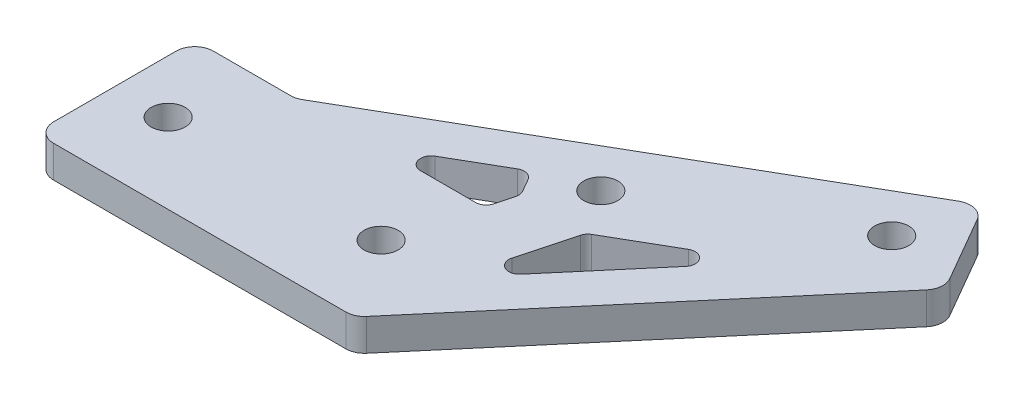
ISO-10303-21;
HEADER;
FILE_DESCRIPTION(('STEP AP214'),'2;1');
FILE_NAME('part.step','',(''),(''),'','','');
FILE_SCHEMA(('AUTOMOTIVE_DESIGN { 1 0 10303 214 1 1 1 1 }'));
ENDSEC;
DATA;
#1=APPLICATION_CONTEXT('core data for automotive mechanical design processes');
#2=APPLICATION_PROTOCOL_DEFINITION('international standard','automotive_design',2000,#1);
#3=PRODUCT_CONTEXT('',#1,'mechanical');
#4=PRODUCT('Part','Part','',(#3));
#5=PRODUCT_RELATED_PRODUCT_CATEGORY('part','',(#4));
#6=PRODUCT_DEFINITION_FORMATION('','',#4);
#7=PRODUCT_DEFINITION_CONTEXT('part definition',#1,'design');
#8=PRODUCT_DEFINITION('design','',#6,#7);
#9=PRODUCT_DEFINITION_SHAPE('','',#8);
#10=(LENGTH_UNIT() NAMED_UNIT(*) SI_UNIT(.MILLI.,.METRE.));
#11=(NAMED_UNIT(*) PLANE_ANGLE_UNIT() SI_UNIT($,.RADIAN.));
#12=(NAMED_UNIT(*) SI_UNIT($,.STERADIAN.) SOLID_ANGLE_UNIT());
#13=UNCERTAINTY_MEASURE_WITH_UNIT(LENGTH_MEASURE(1.E-05),#10,'distance_accuracy_value','');
#14=(GEOMETRIC_REPRESENTATION_CONTEXT(3) GLOBAL_UNCERTAINTY_ASSIGNED_CONTEXT((#13)) GLOBAL_UNIT_ASSIGNED_CONTEXT((#10,
#11,#12)) REPRESENTATION_CONTEXT('',''));
#15=CARTESIAN_POINT('',(0.,0.,0.));
#16=DIRECTION('',(0.,0.,1.));
#17=DIRECTION('',(1.,0.,0.));
#18=AXIS2_PLACEMENT_3D('',#15,#16,#17);
#19=CARTESIAN_POINT('',(0.,1.5,0.));
#20=DIRECTION('',(0.,-1.,0.));
#21=DIRECTION('',(0.,0.,-1.));
#22=AXIS2_PLACEMENT_3D('',#19,#20,#21);
#23=PLANE('',#22);
#24=DIRECTION('',(-0.258819045102521,0.,0.965925826289068));
#25=VECTOR('',#24,1.);
#26=CARTESIAN_POINT('',(31.1181061733477,1.5,8.33807141913447));
#27=LINE('',#26,#25);
#28=CARTESIAN_POINT('',(33.9555869090365,1.5,-2.2515508519542));
#29=VERTEX_POINT('',#28);
#30=CARTESIAN_POINT('',(32.5994607267854,1.5,2.80958096168154));
#31=VERTEX_POINT('',#30);
#32=EDGE_CURVE('E257',#29,#31,#27,.T.);
#33=ORIENTED_EDGE('',*,*,#32,.F.);
#34=CARTESIAN_POINT('',(34.9215127353256,1.5,-1.99273180685168));
#35=DIRECTION('',(0.,-1.,0.));
#36=DIRECTION('',(0.,0.,-1.));
#37=AXIS2_PLACEMENT_3D('',#34,#35,#36);
#38=CIRCLE('',#37,1.);
#39=CARTESIAN_POINT('',(34.4215127353256,1.5,-2.85875721063612));
#40=VERTEX_POINT('',#39);
#41=EDGE_CURVE('E359',#29,#40,#38,.T.);
#42=ORIENTED_EDGE('',*,*,#41,.T.);
#43=DIRECTION('',(0.866025403784438,0.,-0.500000000000001));
#44=VECTOR('',#43,1.);
#45=CARTESIAN_POINT('',(7.36750000000004,1.5,12.7608843247637));
#46=LINE('',#45,#44);
#47=CARTESIAN_POINT('',(40.1791176898745,1.5,-6.18291198103244));
#48=VERTEX_POINT('',#47);
#49=EDGE_CURVE('E254',#40,#48,#46,.T.);
#50=ORIENTED_EDGE('',*,*,#49,.T.);
#51=CARTESIAN_POINT('',(40.6791176898745,1.5,-5.31688657724799));
#52=DIRECTION('',(0.,-1.,0.));
#53=DIRECTION('',(0.,0.,-1.));
#54=AXIS2_PLACEMENT_3D('',#51,#52,#53);
#55=CIRCLE('',#54,1.);
#56=CARTESIAN_POINT('',(41.4416742649251,1.5,-4.66996504425723));
#57=VERTEX_POINT('',#56);
#58=EDGE_CURVE('E363',#48,#57,#55,.T.);
#59=ORIENTED_EDGE('',*,*,#58,.T.);
#60=DIRECTION('',(0.646921532990766,0.,-0.762556575050584));
#61=VECTOR('',#60,1.);
#62=CARTESIAN_POINT('',(21.7942636322427,1.5,18.4893539714611));
#63=LINE('',#62,#61);
#64=CARTESIAN_POINT('',(34.327943128125,1.5,3.71532153977483));
#65=VERTEX_POINT('',#64);
#66=EDGE_CURVE('E247',#65,#57,#63,.T.);
#67=ORIENTED_EDGE('',*,*,#66,.F.);
#68=CARTESIAN_POINT('',(33.5653865530744,1.5,3.06840000678406));
#69=DIRECTION('',(0.,-1.,0.));
#70=DIRECTION('',(0.,0.,-1.));
#71=AXIS2_PLACEMENT_3D('',#68,#69,#70);
#72=CIRCLE('',#71,1.);
#73=EDGE_CURVE('E355',#65,#31,#72,.T.);
#74=ORIENTED_EDGE('',*,*,#73,.T.);
#75=EDGE_LOOP('',(#33,#42,#50,#59,#67,#74));
#76=FACE_BOUND('',#75,.T.);
#77=DIRECTION('',(-1.,0.,0.));
#78=VECTOR('',#77,1.);
#79=CARTESIAN_POINT('',(0.,1.5,0.));
#80=LINE('',#79,#78);
#81=CARTESIAN_POINT('',(9.00108891324583,1.5,0.));
#82=VERTEX_POINT('',#81);
#83=CARTESIAN_POINT('',(1.75,1.5,0.));
#84=VERTEX_POINT('',#83);
#85=EDGE_CURVE('E290',#82,#84,#80,.T.);
#86=ORIENTED_EDGE('',*,*,#85,.T.);
#87=CARTESIAN_POINT('',(1.75,1.5,1.75));
#88=DIRECTION('',(0.,-1.,0.));
#89=DIRECTION('',(0.,0.,-1.));
#90=AXIS2_PLACEMENT_3D('',#87,#88,#89);
#91=CIRCLE('',#90,1.75);
#92=CARTESIAN_POINT('',(0.,1.5,1.75));
#93=VERTEX_POINT('',#92);
#94=EDGE_CURVE('E403',#84,#93,#91,.F.);
#95=ORIENTED_EDGE('',*,*,#94,.T.);
#96=DIRECTION('',(0.,0.,1.));
#97=VECTOR('',#96,1.);
#98=CARTESIAN_POINT('',(0.,1.5,15.));
#99=LINE('',#98,#97);
#100=CARTESIAN_POINT('',(0.,1.5,13.25));
#101=VERTEX_POINT('',#100);
#102=EDGE_CURVE('E294',#93,#101,#99,.T.);
#103=ORIENTED_EDGE('',*,*,#102,.T.);
#104=CARTESIAN_POINT('',(1.75,1.5,13.25));
#105=DIRECTION('',(0.,-1.,0.));
#106=DIRECTION('',(0.,0.,-1.));
#107=AXIS2_PLACEMENT_3D('',#104,#105,#106);
#108=CIRCLE('',#107,1.75);
#109=CARTESIAN_POINT('',(1.75000000000001,1.5,15.));
#110=VERTEX_POINT('',#109);
#111=EDGE_CURVE('E401',#101,#110,#108,.F.);
#112=ORIENTED_EDGE('',*,*,#111,.T.);
#113=DIRECTION('',(1.,0.,0.));
#114=VECTOR('',#113,1.);
#115=CARTESIAN_POINT('',(30.,1.5,15.));
#116=LINE('',#115,#114);
#117=CARTESIAN_POINT('',(29.1897160978185,1.5,15.));
#118=VERTEX_POINT('',#117);
#119=EDGE_CURVE('E297',#110,#118,#116,.T.);
#120=ORIENTED_EDGE('',*,*,#119,.T.);
#121=CARTESIAN_POINT('',(29.1897160978185,1.5,13.25));
#122=DIRECTION('',(0.,-1.,0.));
#123=DIRECTION('',(0.,0.,-1.));
#124=AXIS2_PLACEMENT_3D('',#121,#122,#123);
#125=CIRCLE('',#124,1.75);
#126=CARTESIAN_POINT('',(30.524190104157,1.5,14.3821126827338));
#127=VERTEX_POINT('',#126);
#128=EDGE_CURVE('E396',#118,#127,#125,.F.);
#129=ORIENTED_EDGE('',*,*,#128,.T.);
#130=DIRECTION('',(0.646921532990766,0.,-0.762556575050584));
#131=VECTOR('',#130,1.);
#132=CARTESIAN_POINT('',(55.4507621135331,1.5,-15.));
#133=LINE('',#132,#131);
#134=CARTESIAN_POINT('',(54.6534768491289,1.5,-14.0602026836986));
#135=VERTEX_POINT('',#134);
#136=EDGE_CURVE('E300',#127,#135,#133,.T.);
#137=ORIENTED_EDGE('',*,*,#136,.T.);
#138=CARTESIAN_POINT('',(53.3190028427904,1.5,-15.1923153664324));
#139=DIRECTION('',(0.,-1.,0.));
#140=DIRECTION('',(0.,0.,-1.));
#141=AXIS2_PLACEMENT_3D('',#138,#139,#140);
#142=CIRCLE('',#141,1.75);
#143=CARTESIAN_POINT('',(54.8345472994132,1.5,-16.0673153664324));
#144=VERTEX_POINT('',#143);
#145=EDGE_CURVE('E54',#135,#144,#142,.F.);
#146=ORIENTED_EDGE('',*,*,#145,.T.);
#147=DIRECTION('',(-0.500000000000002,0.,-0.866025403784437));
#148=VECTOR('',#147,1.);
#149=CARTESIAN_POINT('',(50.4507621135332,1.5,-23.6602540378443));
#150=LINE('',#149,#148);
#151=CARTESIAN_POINT('',(51.3257621135332,1.5,-22.1447095812216));
#152=VERTEX_POINT('',#151);
#153=EDGE_CURVE('E302',#144,#152,#150,.T.);
#154=ORIENTED_EDGE('',*,*,#153,.T.);
#155=CARTESIAN_POINT('',(49.8102176569104,1.5,-21.2697095812216));
#156=DIRECTION('',(0.,-1.,0.));
#157=DIRECTION('',(0.,0.,-1.));
#158=AXIS2_PLACEMENT_3D('',#155,#156,#157);
#159=CIRCLE('',#158,1.75);
#160=CARTESIAN_POINT('',(48.9352176569104,1.5,-22.7852540378443));
#161=VERTEX_POINT('',#160);
#162=EDGE_CURVE('E399',#152,#161,#159,.F.);
#163=ORIENTED_EDGE('',*,*,#162,.T.);
#164=DIRECTION('',(-0.866025403784437,0.,0.500000000000002));
#165=VECTOR('',#164,1.);
#166=CARTESIAN_POINT('',(24.47,1.5,-8.66025403784428));
#167=LINE('',#166,#165);
#168=CARTESIAN_POINT('',(9.87608891324584,1.5,-0.234455543377227));
#169=VERTEX_POINT('',#168);
#170=EDGE_CURVE('E287',#161,#169,#167,.T.);
#171=ORIENTED_EDGE('',*,*,#170,.T.);
#172=CARTESIAN_POINT('',(9.00108891324583,1.5,-1.75));
#173=DIRECTION('',(0.,-1.,0.));
#174=DIRECTION('',(0.,0.,-1.));
#175=AXIS2_PLACEMENT_3D('',#172,#173,#174);
#176=CIRCLE('',#175,1.75);
#177=EDGE_CURVE('E11',#169,#82,#176,.T.);
#178=ORIENTED_EDGE('',*,*,#177,.T.);
#179=EDGE_LOOP('',(#86,#95,#103,#112,#120,#129,#137,#146,#154,#163,#171,#178));
#180=FACE_BOUND('',#179,.T.);
#181=CARTESIAN_POINT('',(48.620635094611,1.5,-16.8301270189222));
#182=DIRECTION('',(0.,1.,0.));
#183=DIRECTION('',(0.,0.,1.));
#184=AXIS2_PLACEMENT_3D('',#181,#182,#183);
#185=CIRCLE('',#184,1.59999999999999);
#186=CARTESIAN_POINT('',(48.620635094611,1.5,-15.2301270189222));
#187=VERTEX_POINT('',#186);
#188=EDGE_CURVE('E281',#187,#187,#185,.T.);
#189=ORIENTED_EDGE('',*,*,#188,.F.);
#190=EDGE_LOOP('',(#189));
#191=FACE_BOUND('',#190,.T.);
#192=CARTESIAN_POINT('',(25.,1.5,7.5));
#193=DIRECTION('',(0.,1.,0.));
#194=DIRECTION('',(0.,0.,1.));
#195=AXIS2_PLACEMENT_3D('',#192,#193,#194);
#196=CIRCLE('',#195,1.6);
#197=CARTESIAN_POINT('',(25.,1.5,9.1));
#198=VERTEX_POINT('',#197);
#199=EDGE_CURVE('E275',#198,#198,#196,.T.);
#200=ORIENTED_EDGE('',*,*,#199,.F.);
#201=EDGE_LOOP('',(#200));
#202=FACE_BOUND('',#201,.T.);
#203=CARTESIAN_POINT('',(31.3001270189222,1.5,-6.83012701892215));
#204=DIRECTION('',(0.,1.,0.));
#205=DIRECTION('',(0.,0.,1.));
#206=AXIS2_PLACEMENT_3D('',#203,#204,#205);
#207=CIRCLE('',#206,1.60000000000001);
#208=CARTESIAN_POINT('',(31.3001270189222,1.5,-5.23012701892213));
#209=VERTEX_POINT('',#208);
#210=EDGE_CURVE('E269',#209,#209,#207,.T.);
#211=ORIENTED_EDGE('',*,*,#210,.F.);
#212=EDGE_LOOP('',(#211));
#213=FACE_BOUND('',#212,.T.);
#214=CARTESIAN_POINT('',(5.,1.5,7.5));
#215=DIRECTION('',(0.,1.,0.));
#216=DIRECTION('',(0.,0.,1.));
#217=AXIS2_PLACEMENT_3D('',#214,#215,#216);
#218=CIRCLE('',#217,1.6);
#219=CARTESIAN_POINT('',(5.,1.5,9.1));
#220=VERTEX_POINT('',#219);
#221=EDGE_CURVE('E262',#220,#220,#218,.T.);
#222=ORIENTED_EDGE('',*,*,#221,.F.);
#223=EDGE_LOOP('',(#222));
#224=FACE_BOUND('',#223,.T.);
#225=DIRECTION('',(0.500000000000001,0.,0.866025403784438));
#226=VECTOR('',#225,1.);
#227=CARTESIAN_POINT('',(22.1025,1.5,-12.7608843247637));
#228=LINE('',#227,#226);
#229=CARTESIAN_POINT('',(26.9700000000001,1.5,-4.33012701892208));
#230=VERTEX_POINT('',#229);
#231=CARTESIAN_POINT('',(27.6719029611437,1.5,-3.11439542823822));
#232=VERTEX_POINT('',#231);
#233=EDGE_CURVE('E239',#230,#232,#228,.T.);
#234=ORIENTED_EDGE('',*,*,#233,.T.);
#235=CARTESIAN_POINT('',(26.8058775573593,1.5,-2.61439542823822));
#236=DIRECTION('',(0.,-1.,0.));
#237=DIRECTION('',(0.,0.,-1.));
#238=AXIS2_PLACEMENT_3D('',#235,#236,#237);
#239=CIRCLE('',#238,1.);
#240=CARTESIAN_POINT('',(27.7718033836483,1.5,-2.3555763831357));
#241=VERTEX_POINT('',#240);
#242=EDGE_CURVE('E348',#232,#241,#239,.T.);
#243=ORIENTED_EDGE('',*,*,#242,.T.);
#244=DIRECTION('',(-0.258819045102522,0.,0.965925826289068));
#245=VECTOR('',#244,1.);
#246=CARTESIAN_POINT('',(25.3225512156133,1.5,6.78515714851935));
#247=LINE('',#246,#245);
#248=CARTESIAN_POINT('',(27.3392274323874,1.5,-0.741180954897477));
#249=VERTEX_POINT('',#248);
#250=EDGE_CURVE('E253',#241,#249,#247,.T.);
#251=ORIENTED_EDGE('',*,*,#250,.T.);
#252=CARTESIAN_POINT('',(26.3733016060983,1.5,-1.));
#253=DIRECTION('',(0.,-1.,0.));
#254=DIRECTION('',(0.,0.,-1.));
#255=AXIS2_PLACEMENT_3D('',#252,#253,#254);
#256=CIRCLE('',#255,1.);
#257=CARTESIAN_POINT('',(26.3733016060983,1.5,0.));
#258=VERTEX_POINT('',#257);
#259=EDGE_CURVE('E232',#249,#258,#256,.T.);
#260=ORIENTED_EDGE('',*,*,#259,.T.);
#261=DIRECTION('',(1.,0.,0.));
#262=VECTOR('',#261,1.);
#263=CARTESIAN_POINT('',(0.,1.5,0.));
#264=LINE('',#263,#262);
#265=CARTESIAN_POINT('',(21.2020508075691,1.5,0.));
#266=VERTEX_POINT('',#265);
#267=EDGE_CURVE('E223',#266,#258,#264,.T.);
#268=ORIENTED_EDGE('',*,*,#267,.F.);
#269=CARTESIAN_POINT('',(21.2020508075691,1.5,-1.));
#270=DIRECTION('',(0.,-1.,0.));
#271=DIRECTION('',(0.,0.,-1.));
#272=AXIS2_PLACEMENT_3D('',#269,#270,#271);
#273=CIRCLE('',#272,1.);
#274=CARTESIAN_POINT('',(20.7020508075691,1.5,-1.86602540378444));
#275=VERTEX_POINT('',#274);
#276=EDGE_CURVE('E206',#266,#275,#273,.T.);
#277=ORIENTED_EDGE('',*,*,#276,.T.);
#278=DIRECTION('',(-0.866025403784438,0.,0.500000000000002));
#279=VECTOR('',#278,1.);
#280=CARTESIAN_POINT('',(4.3675000000001,1.5,7.56473190205721));
#281=LINE('',#280,#279);
#282=CARTESIAN_POINT('',(25.6039745962156,1.5,-4.69615242270653));
#283=VERTEX_POINT('',#282);
#284=EDGE_CURVE('E234',#283,#275,#281,.T.);
#285=ORIENTED_EDGE('',*,*,#284,.F.);
#286=CARTESIAN_POINT('',(26.1039745962156,1.5,-3.83012701892209));
#287=DIRECTION('',(0.,-1.,0.));
#288=DIRECTION('',(0.,0.,-1.));
#289=AXIS2_PLACEMENT_3D('',#286,#287,#288);
#290=CIRCLE('',#289,1.);
#291=EDGE_CURVE('E367',#283,#230,#290,.T.);
#292=ORIENTED_EDGE('',*,*,#291,.T.);
#293=EDGE_LOOP('',(#234,#243,#251,#260,#268,#277,#285,#292));
#294=FACE_BOUND('',#293,.T.);
#295=ADVANCED_FACE('F32',(#76,#180,#191,#202,#213,#224,#294),#23,.F.);
#296=CARTESIAN_POINT('',(0.,-1.5,0.));
#297=DIRECTION('',(0.,-1.,0.));
#298=DIRECTION('',(0.,0.,-1.));
#299=AXIS2_PLACEMENT_3D('',#296,#297,#298);
#300=PLANE('',#299);
#301=CARTESIAN_POINT('',(31.3001270189222,-1.5,-6.83012701892215));
#302=DIRECTION('',(0.,1.,0.));
#303=DIRECTION('',(0.,0.,1.));
#304=AXIS2_PLACEMENT_3D('',#301,#302,#303);
#305=CIRCLE('',#304,1.60000000000001);
#306=CARTESIAN_POINT('',(31.3001270189222,-1.5,-5.23012701892213));
#307=VERTEX_POINT('',#306);
#308=EDGE_CURVE('E265',#307,#307,#305,.T.);
#309=ORIENTED_EDGE('',*,*,#308,.T.);
#310=EDGE_LOOP('',(#309));
#311=FACE_BOUND('',#310,.T.);
#312=CARTESIAN_POINT('',(48.620635094611,-1.5,-16.8301270189222));
#313=DIRECTION('',(0.,1.,0.));
#314=DIRECTION('',(0.,0.,1.));
#315=AXIS2_PLACEMENT_3D('',#312,#313,#314);
#316=CIRCLE('',#315,1.59999999999999);
#317=CARTESIAN_POINT('',(48.620635094611,-1.5,-15.2301270189222));
#318=VERTEX_POINT('',#317);
#319=EDGE_CURVE('E278',#318,#318,#316,.T.);
#320=ORIENTED_EDGE('',*,*,#319,.T.);
#321=EDGE_LOOP('',(#320));
#322=FACE_BOUND('',#321,.T.);
#323=DIRECTION('',(0.,0.,1.));
#324=VECTOR('',#323,1.);
#325=CARTESIAN_POINT('',(0.,-1.5,15.));
#326=LINE('',#325,#324);
#327=CARTESIAN_POINT('',(0.,-1.5,1.75));
#328=VERTEX_POINT('',#327);
#329=CARTESIAN_POINT('',(0.,-1.5,13.25));
#330=VERTEX_POINT('',#329);
#331=EDGE_CURVE('E309',#328,#330,#326,.T.);
#332=ORIENTED_EDGE('',*,*,#331,.F.);
#333=CARTESIAN_POINT('',(1.75,-1.5,1.75));
#334=DIRECTION('',(0.,-1.,0.));
#335=DIRECTION('',(0.,0.,-1.));
#336=AXIS2_PLACEMENT_3D('',#333,#334,#335);
#337=CIRCLE('',#336,1.75);
#338=CARTESIAN_POINT('',(1.75,-1.5,0.));
#339=VERTEX_POINT('',#338);
#340=EDGE_CURVE('E394',#328,#339,#337,.T.);
#341=ORIENTED_EDGE('',*,*,#340,.T.);
#342=DIRECTION('',(-1.,0.,0.));
#343=VECTOR('',#342,1.);
#344=CARTESIAN_POINT('',(0.,-1.5,0.));
#345=LINE('',#344,#343);
#346=CARTESIAN_POINT('',(9.00108891324583,-1.5,0.));
#347=VERTEX_POINT('',#346);
#348=EDGE_CURVE('E306',#347,#339,#345,.T.);
#349=ORIENTED_EDGE('',*,*,#348,.F.);
#350=CARTESIAN_POINT('',(9.00108891324583,-1.5,-1.75));
#351=DIRECTION('',(0.,-1.,0.));
#352=DIRECTION('',(0.,0.,-1.));
#353=AXIS2_PLACEMENT_3D('',#350,#351,#352);
#354=CIRCLE('',#353,1.75);
#355=CARTESIAN_POINT('',(9.87608891324584,-1.5,-0.234455543377237));
#356=VERTEX_POINT('',#355);
#357=EDGE_CURVE('E40',#347,#356,#354,.F.);
#358=ORIENTED_EDGE('',*,*,#357,.T.);
#359=DIRECTION('',(-0.866025403784438,0.,0.500000000000001));
#360=VECTOR('',#359,1.);
#361=CARTESIAN_POINT('',(24.47,-1.5,-8.66025403784428));
#362=LINE('',#361,#360);
#363=CARTESIAN_POINT('',(48.9352176569104,-1.5,-22.7852540378443));
#364=VERTEX_POINT('',#363);
#365=EDGE_CURVE('E284',#364,#356,#362,.T.);
#366=ORIENTED_EDGE('',*,*,#365,.F.);
#367=CARTESIAN_POINT('',(49.8102176569104,-1.5,-21.2697095812216));
#368=DIRECTION('',(0.,-1.,0.));
#369=DIRECTION('',(0.,0.,-1.));
#370=AXIS2_PLACEMENT_3D('',#367,#368,#369);
#371=CIRCLE('',#370,1.75);
#372=CARTESIAN_POINT('',(51.3257621135332,-1.5,-22.1447095812216));
#373=VERTEX_POINT('',#372);
#374=EDGE_CURVE('E390',#364,#373,#371,.T.);
#375=ORIENTED_EDGE('',*,*,#374,.T.);
#376=DIRECTION('',(-0.500000000000002,0.,-0.866025403784437));
#377=VECTOR('',#376,1.);
#378=CARTESIAN_POINT('',(50.4507621135332,-1.5,-23.6602540378443));
#379=LINE('',#378,#377);
#380=CARTESIAN_POINT('',(54.8345472994132,-1.5,-16.0673153664324));
#381=VERTEX_POINT('',#380);
#382=EDGE_CURVE('E291',#381,#373,#379,.T.);
#383=ORIENTED_EDGE('',*,*,#382,.F.);
#384=CARTESIAN_POINT('',(53.3190028427904,-1.5,-15.1923153664324));
#385=DIRECTION('',(0.,-1.,0.));
#386=DIRECTION('',(0.,0.,-1.));
#387=AXIS2_PLACEMENT_3D('',#384,#385,#386);
#388=CIRCLE('',#387,1.75);
#389=CARTESIAN_POINT('',(54.6534768491289,-1.5,-14.0602026836986));
#390=VERTEX_POINT('',#389);
#391=EDGE_CURVE('E388',#381,#390,#388,.T.);
#392=ORIENTED_EDGE('',*,*,#391,.T.);
#393=DIRECTION('',(0.646921532990766,0.,-0.762556575050584));
#394=VECTOR('',#393,1.);
#395=CARTESIAN_POINT('',(55.4507621135331,-1.5,-15.));
#396=LINE('',#395,#394);
#397=CARTESIAN_POINT('',(30.524190104157,-1.5,14.3821126827338));
#398=VERTEX_POINT('',#397);
#399=EDGE_CURVE('E315',#398,#390,#396,.T.);
#400=ORIENTED_EDGE('',*,*,#399,.F.);
#401=CARTESIAN_POINT('',(29.1897160978185,-1.5,13.25));
#402=DIRECTION('',(0.,-1.,0.));
#403=DIRECTION('',(0.,0.,-1.));
#404=AXIS2_PLACEMENT_3D('',#401,#402,#403);
#405=CIRCLE('',#404,1.75);
#406=CARTESIAN_POINT('',(29.1897160978185,-1.5,15.));
#407=VERTEX_POINT('',#406);
#408=EDGE_CURVE('E386',#398,#407,#405,.T.);
#409=ORIENTED_EDGE('',*,*,#408,.T.);
#410=DIRECTION('',(1.,0.,0.));
#411=VECTOR('',#410,1.);
#412=CARTESIAN_POINT('',(30.,-1.5,15.));
#413=LINE('',#412,#411);
#414=CARTESIAN_POINT('',(1.75000000000001,-1.5,15.));
#415=VERTEX_POINT('',#414);
#416=EDGE_CURVE('E312',#415,#407,#413,.T.);
#417=ORIENTED_EDGE('',*,*,#416,.F.);
#418=CARTESIAN_POINT('',(1.75,-1.5,13.25));
#419=DIRECTION('',(0.,-1.,0.));
#420=DIRECTION('',(0.,0.,-1.));
#421=AXIS2_PLACEMENT_3D('',#418,#419,#420);
#422=CIRCLE('',#421,1.75);
#423=EDGE_CURVE('E392',#415,#330,#422,.T.);
#424=ORIENTED_EDGE('',*,*,#423,.T.);
#425=EDGE_LOOP('',(#332,#341,#349,#358,#366,#375,#383,#392,#400,#409,#417,#424));
#426=FACE_BOUND('',#425,.T.);
#427=CARTESIAN_POINT('',(25.,-1.5,7.5));
#428=DIRECTION('',(0.,1.,0.));
#429=DIRECTION('',(0.,0.,1.));
#430=AXIS2_PLACEMENT_3D('',#427,#428,#429);
#431=CIRCLE('',#430,1.6);
#432=CARTESIAN_POINT('',(25.,-1.5,9.1));
#433=VERTEX_POINT('',#432);
#434=EDGE_CURVE('E272',#433,#433,#431,.T.);
#435=ORIENTED_EDGE('',*,*,#434,.T.);
#436=EDGE_LOOP('',(#435));
#437=FACE_BOUND('',#436,.T.);
#438=CARTESIAN_POINT('',(5.,-1.5,7.5));
#439=DIRECTION('',(0.,1.,0.));
#440=DIRECTION('',(0.,0.,1.));
#441=AXIS2_PLACEMENT_3D('',#438,#439,#440);
#442=CIRCLE('',#441,1.6);
#443=CARTESIAN_POINT('',(5.,-1.5,9.1));
#444=VERTEX_POINT('',#443);
#445=EDGE_CURVE('E266',#444,#444,#442,.T.);
#446=ORIENTED_EDGE('',*,*,#445,.T.);
#447=EDGE_LOOP('',(#446));
#448=FACE_BOUND('',#447,.T.);
#449=DIRECTION('',(-0.258819045102521,0.,0.965925826289068));
#450=VECTOR('',#449,1.);
#451=CARTESIAN_POINT('',(31.1181061733477,-1.5,8.33807141913447));
#452=LINE('',#451,#450);
#453=CARTESIAN_POINT('',(33.9555869090365,-1.5,-2.2515508519542));
#454=VERTEX_POINT('',#453);
#455=CARTESIAN_POINT('',(32.5994607267854,-1.5,2.80958096168154));
#456=VERTEX_POINT('',#455);
#457=EDGE_CURVE('E246',#454,#456,#452,.T.);
#458=ORIENTED_EDGE('',*,*,#457,.T.);
#459=CARTESIAN_POINT('',(33.5653865530744,-1.5,3.06840000678406));
#460=DIRECTION('',(0.,-1.,0.));
#461=DIRECTION('',(0.,0.,-1.));
#462=AXIS2_PLACEMENT_3D('',#459,#460,#461);
#463=CIRCLE('',#462,1.);
#464=CARTESIAN_POINT('',(34.327943128125,-1.5,3.71532153977483));
#465=VERTEX_POINT('',#464);
#466=EDGE_CURVE('E357',#456,#465,#463,.F.);
#467=ORIENTED_EDGE('',*,*,#466,.T.);
#468=DIRECTION('',(0.646921532990766,0.,-0.762556575050584));
#469=VECTOR('',#468,1.);
#470=CARTESIAN_POINT('',(21.7942636322427,-1.5,18.4893539714611));
#471=LINE('',#470,#469);
#472=CARTESIAN_POINT('',(41.4416742649251,-1.5,-4.66996504425723));
#473=VERTEX_POINT('',#472);
#474=EDGE_CURVE('E250',#465,#473,#471,.T.);
#475=ORIENTED_EDGE('',*,*,#474,.T.);
#476=CARTESIAN_POINT('',(40.6791176898745,-1.5,-5.31688657724799));
#477=DIRECTION('',(0.,-1.,0.));
#478=DIRECTION('',(0.,0.,-1.));
#479=AXIS2_PLACEMENT_3D('',#476,#477,#478);
#480=CIRCLE('',#479,1.);
#481=CARTESIAN_POINT('',(40.1791176898745,-1.5,-6.18291198103244));
#482=VERTEX_POINT('',#481);
#483=EDGE_CURVE('E365',#473,#482,#480,.F.);
#484=ORIENTED_EDGE('',*,*,#483,.T.);
#485=DIRECTION('',(0.866025403784438,0.,-0.500000000000001));
#486=VECTOR('',#485,1.);
#487=CARTESIAN_POINT('',(7.36750000000004,-1.5,12.7608843247637));
#488=LINE('',#487,#486);
#489=CARTESIAN_POINT('',(34.4215127353256,-1.5,-2.85875721063612));
#490=VERTEX_POINT('',#489);
#491=EDGE_CURVE('E243',#490,#482,#488,.T.);
#492=ORIENTED_EDGE('',*,*,#491,.F.);
#493=CARTESIAN_POINT('',(34.9215127353256,-1.5,-1.99273180685168));
#494=DIRECTION('',(0.,-1.,0.));
#495=DIRECTION('',(0.,0.,-1.));
#496=AXIS2_PLACEMENT_3D('',#493,#494,#495);
#497=CIRCLE('',#496,1.);
#498=EDGE_CURVE('E361',#490,#454,#497,.F.);
#499=ORIENTED_EDGE('',*,*,#498,.T.);
#500=EDGE_LOOP('',(#458,#467,#475,#484,#492,#499));
#501=FACE_BOUND('',#500,.T.);
#502=DIRECTION('',(-0.866025403784438,0.,0.500000000000002));
#503=VECTOR('',#502,1.);
#504=CARTESIAN_POINT('',(4.3675000000001,-1.5,7.56473190205721));
#505=LINE('',#504,#503);
#506=CARTESIAN_POINT('',(25.6039745962156,-1.5,-4.69615242270653));
#507=VERTEX_POINT('',#506);
#508=CARTESIAN_POINT('',(20.7020508075691,-1.5,-1.86602540378444));
#509=VERTEX_POINT('',#508);
#510=EDGE_CURVE('E774',#507,#509,#505,.T.);
#511=ORIENTED_EDGE('',*,*,#510,.T.);
#512=CARTESIAN_POINT('',(21.2020508075691,-1.5,-1.));
#513=DIRECTION('',(0.,-1.,0.));
#514=DIRECTION('',(0.,0.,-1.));
#515=AXIS2_PLACEMENT_3D('',#512,#513,#514);
#516=CIRCLE('',#515,1.);
#517=CARTESIAN_POINT('',(21.2020508075691,-1.5,0.));
#518=VERTEX_POINT('',#517);
#519=EDGE_CURVE('E216',#509,#518,#516,.F.);
#520=ORIENTED_EDGE('',*,*,#519,.T.);
#521=DIRECTION('',(1.,0.,0.));
#522=VECTOR('',#521,1.);
#523=CARTESIAN_POINT('',(0.,-1.5,0.));
#524=LINE('',#523,#522);
#525=CARTESIAN_POINT('',(26.3733016060983,-1.5,0.));
#526=VERTEX_POINT('',#525);
#527=EDGE_CURVE('E226',#518,#526,#524,.T.);
#528=ORIENTED_EDGE('',*,*,#527,.T.);
#529=CARTESIAN_POINT('',(26.3733016060983,-1.5,-1.));
#530=DIRECTION('',(0.,-1.,0.));
#531=DIRECTION('',(0.,0.,-1.));
#532=AXIS2_PLACEMENT_3D('',#529,#530,#531);
#533=CIRCLE('',#532,1.);
#534=CARTESIAN_POINT('',(27.3392274323874,-1.5,-0.741180954897477));
#535=VERTEX_POINT('',#534);
#536=EDGE_CURVE('E353',#526,#535,#533,.F.);
#537=ORIENTED_EDGE('',*,*,#536,.T.);
#538=DIRECTION('',(-0.258819045102522,0.,0.965925826289068));
#539=VECTOR('',#538,1.);
#540=CARTESIAN_POINT('',(25.3225512156133,-1.5,6.78515714851935));
#541=LINE('',#540,#539);
#542=CARTESIAN_POINT('',(27.7718033836483,-1.5,-2.3555763831357));
#543=VERTEX_POINT('',#542);
#544=EDGE_CURVE('E233',#543,#535,#541,.T.);
#545=ORIENTED_EDGE('',*,*,#544,.F.);
#546=CARTESIAN_POINT('',(26.8058775573593,-1.5,-2.61439542823822));
#547=DIRECTION('',(0.,-1.,0.));
#548=DIRECTION('',(0.,0.,-1.));
#549=AXIS2_PLACEMENT_3D('',#546,#547,#548);
#550=CIRCLE('',#549,1.);
#551=CARTESIAN_POINT('',(27.6719029611437,-1.5,-3.11439542823822));
#552=VERTEX_POINT('',#551);
#553=EDGE_CURVE('E350',#543,#552,#550,.F.);
#554=ORIENTED_EDGE('',*,*,#553,.T.);
#555=DIRECTION('',(0.500000000000001,0.,0.866025403784438));
#556=VECTOR('',#555,1.);
#557=CARTESIAN_POINT('',(22.1025,-1.5,-12.7608843247637));
#558=LINE('',#557,#556);
#559=CARTESIAN_POINT('',(26.9700000000001,-1.5,-4.33012701892208));
#560=VERTEX_POINT('',#559);
#561=EDGE_CURVE('E237',#560,#552,#558,.T.);
#562=ORIENTED_EDGE('',*,*,#561,.F.);
#563=CARTESIAN_POINT('',(26.1039745962156,-1.5,-3.83012701892209));
#564=DIRECTION('',(0.,-1.,0.));
#565=DIRECTION('',(0.,0.,-1.));
#566=AXIS2_PLACEMENT_3D('',#563,#564,#565);
#567=CIRCLE('',#566,1.);
#568=EDGE_CURVE('E369',#560,#507,#567,.F.);
#569=ORIENTED_EDGE('',*,*,#568,.T.);
#570=EDGE_LOOP('',(#511,#520,#528,#537,#545,#554,#562,#569));
#571=FACE_BOUND('',#570,.T.);
#572=ADVANCED_FACE('F422',(#311,#322,#426,#437,#448,#501,#571),#300,.T.);
#573=CARTESIAN_POINT('',(24.47,1.5,-8.66025403784428));
#574=DIRECTION('',(0.500000000000002,0.,0.866025403784438));
#575=DIRECTION('',(0.866025403784438,0.,-0.500000000000002));
#576=AXIS2_PLACEMENT_3D('',#573,#574,#575);
#577=PLANE('',#576);
#578=ORIENTED_EDGE('',*,*,#365,.T.);
#579=DIRECTION('',(0.,-1.,0.));
#580=VECTOR('',#579,1.);
#581=CARTESIAN_POINT('',(9.87608891324584,1.5,-0.234455543377234));
#582=LINE('',#581,#580);
#583=EDGE_CURVE('E379',#356,#169,#582,.F.);
#584=ORIENTED_EDGE('',*,*,#583,.T.);
#585=ORIENTED_EDGE('',*,*,#170,.F.);
#586=DIRECTION('',(0.,-1.,0.));
#587=VECTOR('',#586,1.);
#588=CARTESIAN_POINT('',(48.9352176569104,1.5,-22.7852540378443));
#589=LINE('',#588,#587);
#590=EDGE_CURVE('E376',#161,#364,#589,.T.);
#591=ORIENTED_EDGE('',*,*,#590,.T.);
#592=EDGE_LOOP('',(#578,#584,#585,#591));
#593=FACE_BOUND('',#592,.T.);
#594=ADVANCED_FACE('F428',(#593),#577,.F.);
#595=CARTESIAN_POINT('',(0.,1.5,0.));
#596=DIRECTION('',(0.,0.,1.));
#597=DIRECTION('',(1.,0.,0.));
#598=AXIS2_PLACEMENT_3D('',#595,#596,#597);
#599=PLANE('',#598);
#600=ORIENTED_EDGE('',*,*,#85,.F.);
#601=DIRECTION('',(0.,-1.,0.));
#602=VECTOR('',#601,1.);
#603=CARTESIAN_POINT('',(9.00108891324583,-1.5,0.));
#604=LINE('',#603,#602);
#605=EDGE_CURVE('E373',#82,#347,#604,.T.);
#606=ORIENTED_EDGE('',*,*,#605,.T.);
#607=ORIENTED_EDGE('',*,*,#348,.T.);
#608=DIRECTION('',(0.,-1.,0.));
#609=VECTOR('',#608,1.);
#610=CARTESIAN_POINT('',(1.75,1.5,0.));
#611=LINE('',#610,#609);
#612=EDGE_CURVE('E371',#339,#84,#611,.F.);
#613=ORIENTED_EDGE('',*,*,#612,.T.);
#614=EDGE_LOOP('',(#600,#606,#607,#613));
#615=FACE_BOUND('',#614,.T.);
#616=ADVANCED_FACE('F437',(#615),#599,.F.);
#617=CARTESIAN_POINT('',(0.,1.5,15.));
#618=DIRECTION('',(1.,0.,0.));
#619=DIRECTION('',(0.,0.,-1.));
#620=AXIS2_PLACEMENT_3D('',#617,#618,#619);
#621=PLANE('',#620);
#622=ORIENTED_EDGE('',*,*,#102,.F.);
#623=DIRECTION('',(0.,-1.,0.));
#624=VECTOR('',#623,1.);
#625=CARTESIAN_POINT('',(0.,1.5,1.75));
#626=LINE('',#625,#624);
#627=EDGE_CURVE('E383',#93,#328,#626,.T.);
#628=ORIENTED_EDGE('',*,*,#627,.T.);
#629=ORIENTED_EDGE('',*,*,#331,.T.);
#630=DIRECTION('',(0.,-1.,0.));
#631=VECTOR('',#630,1.);
#632=CARTESIAN_POINT('',(0.,1.5,13.25));
#633=LINE('',#632,#631);
#634=EDGE_CURVE('E381',#330,#101,#633,.F.);
#635=ORIENTED_EDGE('',*,*,#634,.T.);
#636=EDGE_LOOP('',(#622,#628,#629,#635));
#637=FACE_BOUND('',#636,.T.);
#638=ADVANCED_FACE('F445',(#637),#621,.F.);
#639=CARTESIAN_POINT('',(30.,1.5,15.));
#640=DIRECTION('',(0.,0.,-1.));
#641=DIRECTION('',(-1.,0.,0.));
#642=AXIS2_PLACEMENT_3D('',#639,#640,#641);
#643=PLANE('',#642);
#644=ORIENTED_EDGE('',*,*,#119,.F.);
#645=DIRECTION('',(0.,-1.,0.));
#646=VECTOR('',#645,1.);
#647=CARTESIAN_POINT('',(1.75,1.5,15.));
#648=LINE('',#647,#646);
#649=EDGE_CURVE('E407',#110,#415,#648,.T.);
#650=ORIENTED_EDGE('',*,*,#649,.T.);
#651=ORIENTED_EDGE('',*,*,#416,.T.);
#652=DIRECTION('',(0.,-1.,0.));
#653=VECTOR('',#652,1.);
#654=CARTESIAN_POINT('',(29.1897160978185,1.5,15.));
#655=LINE('',#654,#653);
#656=EDGE_CURVE('E405',#407,#118,#655,.F.);
#657=ORIENTED_EDGE('',*,*,#656,.T.);
#658=EDGE_LOOP('',(#644,#650,#651,#657));
#659=FACE_BOUND('',#658,.T.);
#660=ADVANCED_FACE('F453',(#659),#643,.F.);
#661=CARTESIAN_POINT('',(55.4507621135331,1.5,-15.));
#662=DIRECTION('',(-0.762556575050584,0.,-0.646921532990766));
#663=DIRECTION('',(-0.646921532990766,0.,0.762556575050584));
#664=AXIS2_PLACEMENT_3D('',#661,#662,#663);
#665=PLANE('',#664);
#666=ORIENTED_EDGE('',*,*,#399,.T.);
#667=DIRECTION('',(0.,-1.,0.));
#668=VECTOR('',#667,1.);
#669=CARTESIAN_POINT('',(54.6534768491289,1.5,-14.0602026836986));
#670=LINE('',#669,#668);
#671=EDGE_CURVE('E417',#390,#135,#670,.F.);
#672=ORIENTED_EDGE('',*,*,#671,.T.);
#673=ORIENTED_EDGE('',*,*,#136,.F.);
#674=DIRECTION('',(0.,-1.,0.));
#675=VECTOR('',#674,1.);
#676=CARTESIAN_POINT('',(30.524190104157,1.5,14.3821126827338));
#677=LINE('',#676,#675);
#678=EDGE_CURVE('E414',#127,#398,#677,.T.);
#679=ORIENTED_EDGE('',*,*,#678,.T.);
#680=EDGE_LOOP('',(#666,#672,#673,#679));
#681=FACE_BOUND('',#680,.T.);
#682=ADVANCED_FACE('F460',(#681),#665,.F.);
#683=CARTESIAN_POINT('',(50.4507621135332,1.5,-23.6602540378443));
#684=DIRECTION('',(-0.866025403784437,0.,0.500000000000002));
#685=DIRECTION('',(0.500000000000002,0.,0.866025403784437));
#686=AXIS2_PLACEMENT_3D('',#683,#684,#685);
#687=PLANE('',#686);
#688=ORIENTED_EDGE('',*,*,#382,.T.);
#689=DIRECTION('',(0.,-1.,0.));
#690=VECTOR('',#689,1.);
#691=CARTESIAN_POINT('',(51.3257621135332,1.5,-22.1447095812216));
#692=LINE('',#691,#690);
#693=EDGE_CURVE('E47',#373,#152,#692,.F.);
#694=ORIENTED_EDGE('',*,*,#693,.T.);
#695=ORIENTED_EDGE('',*,*,#153,.F.);
#696=DIRECTION('',(0.,-1.,0.));
#697=VECTOR('',#696,1.);
#698=CARTESIAN_POINT('',(54.8345472994132,1.5,-16.0673153664324));
#699=LINE('',#698,#697);
#700=EDGE_CURVE('E410',#144,#381,#699,.T.);
#701=ORIENTED_EDGE('',*,*,#700,.T.);
#702=EDGE_LOOP('',(#688,#694,#695,#701));
#703=FACE_BOUND('',#702,.T.);
#704=ADVANCED_FACE('F467',(#703),#687,.F.);
#705=CARTESIAN_POINT('',(48.620635094611,1.5,-16.8301270189222));
#706=DIRECTION('',(0.,-1.,0.));
#707=DIRECTION('',(0.,0.,-1.));
#708=AXIS2_PLACEMENT_3D('',#705,#706,#707);
#709=CYLINDRICAL_SURFACE('',#708,1.59999999999999);
#710=ORIENTED_EDGE('',*,*,#188,.T.);
#711=EDGE_LOOP('',(#710));
#712=FACE_BOUND('',#711,.T.);
#713=ORIENTED_EDGE('',*,*,#319,.F.);
#714=EDGE_LOOP('',(#713));
#715=FACE_BOUND('',#714,.T.);
#716=ADVANCED_FACE('F488',(#712,#715),#709,.F.);
#717=CARTESIAN_POINT('',(25.,1.5,7.5));
#718=DIRECTION('',(0.,-1.,0.));
#719=DIRECTION('',(0.,0.,-1.));
#720=AXIS2_PLACEMENT_3D('',#717,#718,#719);
#721=CYLINDRICAL_SURFACE('',#720,1.6);
#722=ORIENTED_EDGE('',*,*,#199,.T.);
#723=EDGE_LOOP('',(#722));
#724=FACE_BOUND('',#723,.T.);
#725=ORIENTED_EDGE('',*,*,#434,.F.);
#726=EDGE_LOOP('',(#725));
#727=FACE_BOUND('',#726,.T.);
#728=ADVANCED_FACE('F688',(#724,#727),#721,.F.);
#729=CARTESIAN_POINT('',(31.3001270189222,1.5,-6.83012701892215));
#730=DIRECTION('',(0.,-1.,0.));
#731=DIRECTION('',(0.,0.,-1.));
#732=AXIS2_PLACEMENT_3D('',#729,#730,#731);
#733=CYLINDRICAL_SURFACE('',#732,1.60000000000001);
#734=ORIENTED_EDGE('',*,*,#210,.T.);
#735=EDGE_LOOP('',(#734));
#736=FACE_BOUND('',#735,.T.);
#737=ORIENTED_EDGE('',*,*,#308,.F.);
#738=EDGE_LOOP('',(#737));
#739=FACE_BOUND('',#738,.T.);
#740=ADVANCED_FACE('F677',(#736,#739),#733,.F.);
#741=CARTESIAN_POINT('',(5.,1.5,7.5));
#742=DIRECTION('',(0.,-1.,0.));
#743=DIRECTION('',(0.,0.,-1.));
#744=AXIS2_PLACEMENT_3D('',#741,#742,#743);
#745=CYLINDRICAL_SURFACE('',#744,1.6);
#746=ORIENTED_EDGE('',*,*,#221,.T.);
#747=EDGE_LOOP('',(#746));
#748=FACE_BOUND('',#747,.T.);
#749=ORIENTED_EDGE('',*,*,#445,.F.);
#750=EDGE_LOOP('',(#749));
#751=FACE_BOUND('',#750,.T.);
#752=ADVANCED_FACE('F666',(#748,#751),#745,.F.);
#753=CARTESIAN_POINT('',(7.36750000000004,-1.5,12.7608843247637));
#754=DIRECTION('',(0.500000000000001,0.,0.866025403784438));
#755=DIRECTION('',(0.866025403784438,0.,-0.500000000000001));
#756=AXIS2_PLACEMENT_3D('',#753,#754,#755);
#757=PLANE('',#756);
#758=ORIENTED_EDGE('',*,*,#49,.F.);
#759=DIRECTION('',(0.,1.,0.));
#760=VECTOR('',#759,1.);
#761=CARTESIAN_POINT('',(34.4215127353256,-1.5,-2.85875721063611));
#762=LINE('',#761,#760);
#763=EDGE_CURVE('E217',#40,#490,#762,.F.);
#764=ORIENTED_EDGE('',*,*,#763,.T.);
#765=ORIENTED_EDGE('',*,*,#491,.T.);
#766=DIRECTION('',(0.,1.,0.));
#767=VECTOR('',#766,1.);
#768=CARTESIAN_POINT('',(40.1791176898745,-1.5,-6.18291198103243));
#769=LINE('',#768,#767);
#770=EDGE_CURVE('E343',#482,#48,#769,.T.);
#771=ORIENTED_EDGE('',*,*,#770,.T.);
#772=EDGE_LOOP('',(#758,#764,#765,#771));
#773=FACE_BOUND('',#772,.T.);
#774=ADVANCED_FACE('F656',(#773),#757,.T.);
#775=CARTESIAN_POINT('',(21.7942636322427,-1.5,18.4893539714611));
#776=DIRECTION('',(0.762556575050584,0.,0.646921532990766));
#777=DIRECTION('',(0.646921532990766,0.,-0.762556575050584));
#778=AXIS2_PLACEMENT_3D('',#775,#776,#777);
#779=PLANE('',#778);
#780=ORIENTED_EDGE('',*,*,#474,.F.);
#781=DIRECTION('',(0.,1.,0.));
#782=VECTOR('',#781,1.);
#783=CARTESIAN_POINT('',(34.327943128125,1.5,3.71532153977483));
#784=LINE('',#783,#782);
#785=EDGE_CURVE('E335',#465,#65,#784,.T.);
#786=ORIENTED_EDGE('',*,*,#785,.T.);
#787=ORIENTED_EDGE('',*,*,#66,.T.);
#788=DIRECTION('',(0.,1.,0.));
#789=VECTOR('',#788,1.);
#790=CARTESIAN_POINT('',(41.4416742649251,-1.5,-4.66996504425723));
#791=LINE('',#790,#789);
#792=EDGE_CURVE('E333',#57,#473,#791,.F.);
#793=ORIENTED_EDGE('',*,*,#792,.T.);
#794=EDGE_LOOP('',(#780,#786,#787,#793));
#795=FACE_BOUND('',#794,.T.);
#796=ADVANCED_FACE('F644',(#795),#779,.F.);
#797=CARTESIAN_POINT('',(31.1181061733477,-1.5,8.33807141913447));
#798=DIRECTION('',(-0.965925826289068,0.,-0.258819045102521));
#799=DIRECTION('',(-0.258819045102521,0.,0.965925826289068));
#800=AXIS2_PLACEMENT_3D('',#797,#798,#799);
#801=PLANE('',#800);
#802=ORIENTED_EDGE('',*,*,#32,.T.);
#803=DIRECTION('',(0.,1.,0.));
#804=VECTOR('',#803,1.);
#805=CARTESIAN_POINT('',(32.5994607267854,-1.5,2.80958096168154));
#806=LINE('',#805,#804);
#807=EDGE_CURVE('E341',#31,#456,#806,.F.);
#808=ORIENTED_EDGE('',*,*,#807,.T.);
#809=ORIENTED_EDGE('',*,*,#457,.F.);
#810=DIRECTION('',(0.,1.,0.));
#811=VECTOR('',#810,1.);
#812=CARTESIAN_POINT('',(33.9555869090365,-1.5,-2.2515508519542));
#813=LINE('',#812,#811);
#814=EDGE_CURVE('E338',#454,#29,#813,.T.);
#815=ORIENTED_EDGE('',*,*,#814,.T.);
#816=EDGE_LOOP('',(#802,#808,#809,#815));
#817=FACE_BOUND('',#816,.T.);
#818=ADVANCED_FACE('F635',(#817),#801,.F.);
#819=CARTESIAN_POINT('',(25.3225512156133,-1.5,6.78515714851935));
#820=DIRECTION('',(-0.965925826289068,0.,-0.258819045102522));
#821=DIRECTION('',(-0.258819045102522,0.,0.965925826289068));
#822=AXIS2_PLACEMENT_3D('',#819,#820,#821);
#823=PLANE('',#822);
#824=ORIENTED_EDGE('',*,*,#250,.F.);
#825=DIRECTION('',(0.,1.,0.));
#826=VECTOR('',#825,1.);
#827=CARTESIAN_POINT('',(27.7718033836483,-1.5,-2.3555763831357));
#828=LINE('',#827,#826);
#829=EDGE_CURVE('E331',#241,#543,#828,.F.);
#830=ORIENTED_EDGE('',*,*,#829,.T.);
#831=ORIENTED_EDGE('',*,*,#544,.T.);
#832=DIRECTION('',(0.,1.,0.));
#833=VECTOR('',#832,1.);
#834=CARTESIAN_POINT('',(27.3392274323874,-1.5,-0.741180954897477));
#835=LINE('',#834,#833);
#836=EDGE_CURVE('E328',#535,#249,#835,.T.);
#837=ORIENTED_EDGE('',*,*,#836,.T.);
#838=EDGE_LOOP('',(#824,#830,#831,#837));
#839=FACE_BOUND('',#838,.T.);
#840=ADVANCED_FACE('F627',(#839),#823,.T.);
#841=CARTESIAN_POINT('',(0.,-1.5,0.));
#842=DIRECTION('',(0.,0.,1.));
#843=DIRECTION('',(1.,0.,0.));
#844=AXIS2_PLACEMENT_3D('',#841,#842,#843);
#845=PLANE('',#844);
#846=ORIENTED_EDGE('',*,*,#527,.F.);
#847=DIRECTION('',(0.,1.,0.));
#848=VECTOR('',#847,1.);
#849=CARTESIAN_POINT('',(21.2020508075691,1.5,0.));
#850=LINE('',#849,#848);
#851=EDGE_CURVE('E210',#518,#266,#850,.T.);
#852=ORIENTED_EDGE('',*,*,#851,.T.);
#853=ORIENTED_EDGE('',*,*,#267,.T.);
#854=DIRECTION('',(0.,1.,0.));
#855=VECTOR('',#854,1.);
#856=CARTESIAN_POINT('',(26.3733016060983,-1.5,0.));
#857=LINE('',#856,#855);
#858=EDGE_CURVE('E228',#258,#526,#857,.F.);
#859=ORIENTED_EDGE('',*,*,#858,.T.);
#860=EDGE_LOOP('',(#846,#852,#853,#859));
#861=FACE_BOUND('',#860,.T.);
#862=ADVANCED_FACE('F222',(#861),#845,.F.);
#863=CARTESIAN_POINT('',(4.3675000000001,-1.5,7.56473190205721));
#864=DIRECTION('',(-0.500000000000002,0.,-0.866025403784438));
#865=DIRECTION('',(-0.866025403784438,0.,0.500000000000002));
#866=AXIS2_PLACEMENT_3D('',#863,#864,#865);
#867=PLANE('',#866);
#868=ORIENTED_EDGE('',*,*,#284,.T.);
#869=DIRECTION('',(0.,1.,0.));
#870=VECTOR('',#869,1.);
#871=CARTESIAN_POINT('',(20.7020508075691,-1.5,-1.86602540378444));
#872=LINE('',#871,#870);
#873=EDGE_CURVE('E211',#275,#509,#872,.F.);
#874=ORIENTED_EDGE('',*,*,#873,.T.);
#875=ORIENTED_EDGE('',*,*,#510,.F.);
#876=DIRECTION('',(0.,1.,0.));
#877=VECTOR('',#876,1.);
#878=CARTESIAN_POINT('',(25.6039745962156,-1.5,-4.69615242270652));
#879=LINE('',#878,#877);
#880=EDGE_CURVE('E227',#507,#283,#879,.T.);
#881=ORIENTED_EDGE('',*,*,#880,.T.);
#882=EDGE_LOOP('',(#868,#874,#875,#881));
#883=FACE_BOUND('',#882,.T.);
#884=ADVANCED_FACE('F610',(#883),#867,.F.);
#885=CARTESIAN_POINT('',(22.1025,-1.5,-12.7608843247637));
#886=DIRECTION('',(-0.866025403784438,0.,0.500000000000001));
#887=DIRECTION('',(0.500000000000001,0.,0.866025403784438));
#888=AXIS2_PLACEMENT_3D('',#885,#886,#887);
#889=PLANE('',#888);
#890=ORIENTED_EDGE('',*,*,#561,.T.);
#891=DIRECTION('',(0.,1.,0.));
#892=VECTOR('',#891,1.);
#893=CARTESIAN_POINT('',(27.6719029611437,1.5,-3.11439542823822));
#894=LINE('',#893,#892);
#895=EDGE_CURVE('E325',#552,#232,#894,.T.);
#896=ORIENTED_EDGE('',*,*,#895,.T.);
#897=ORIENTED_EDGE('',*,*,#233,.F.);
#898=DIRECTION('',(0.,1.,0.));
#899=VECTOR('',#898,1.);
#900=CARTESIAN_POINT('',(26.9700000000001,-1.5,-4.33012701892208));
#901=LINE('',#900,#899);
#902=EDGE_CURVE('E323',#230,#560,#901,.F.);
#903=ORIENTED_EDGE('',*,*,#902,.T.);
#904=EDGE_LOOP('',(#890,#896,#897,#903));
#905=FACE_BOUND('',#904,.T.);
#906=ADVANCED_FACE('F506',(#905),#889,.T.);
#907=CARTESIAN_POINT('',(21.2020508075691,-1.5,-1.));
#908=DIRECTION('',(0.,-1.,0.));
#909=DIRECTION('',(0.,0.,-1.));
#910=AXIS2_PLACEMENT_3D('',#907,#908,#909);
#911=CYLINDRICAL_SURFACE('',#910,1.);
#912=ORIENTED_EDGE('',*,*,#519,.F.);
#913=ORIENTED_EDGE('',*,*,#873,.F.);
#914=ORIENTED_EDGE('',*,*,#276,.F.);
#915=ORIENTED_EDGE('',*,*,#851,.F.);
#916=EDGE_LOOP('',(#912,#913,#914,#915));
#917=FACE_BOUND('',#916,.T.);
#918=ADVANCED_FACE('F209',(#917),#911,.F.);
#919=CARTESIAN_POINT('',(26.8058775573593,-1.5,-2.61439542823822));
#920=DIRECTION('',(0.,-1.,0.));
#921=DIRECTION('',(0.,0.,-1.));
#922=AXIS2_PLACEMENT_3D('',#919,#920,#921);
#923=CYLINDRICAL_SURFACE('',#922,1.);
#924=ORIENTED_EDGE('',*,*,#553,.F.);
#925=ORIENTED_EDGE('',*,*,#829,.F.);
#926=ORIENTED_EDGE('',*,*,#242,.F.);
#927=ORIENTED_EDGE('',*,*,#895,.F.);
#928=EDGE_LOOP('',(#924,#925,#926,#927));
#929=FACE_BOUND('',#928,.T.);
#930=ADVANCED_FACE('F505',(#929),#923,.F.);
#931=CARTESIAN_POINT('',(26.3733016060983,-1.5,-1.));
#932=DIRECTION('',(0.,1.,0.));
#933=DIRECTION('',(0.,0.,1.));
#934=AXIS2_PLACEMENT_3D('',#931,#932,#933);
#935=CYLINDRICAL_SURFACE('',#934,1.);
#936=ORIENTED_EDGE('',*,*,#536,.F.);
#937=ORIENTED_EDGE('',*,*,#858,.F.);
#938=ORIENTED_EDGE('',*,*,#259,.F.);
#939=ORIENTED_EDGE('',*,*,#836,.F.);
#940=EDGE_LOOP('',(#936,#937,#938,#939));
#941=FACE_BOUND('',#940,.T.);
#942=ADVANCED_FACE('F509',(#941),#935,.F.);
#943=CARTESIAN_POINT('',(33.5653865530744,-1.5,3.06840000678406));
#944=DIRECTION('',(0.,-1.,0.));
#945=DIRECTION('',(0.,0.,-1.));
#946=AXIS2_PLACEMENT_3D('',#943,#944,#945);
#947=CYLINDRICAL_SURFACE('',#946,1.);
#948=ORIENTED_EDGE('',*,*,#466,.F.);
#949=ORIENTED_EDGE('',*,*,#807,.F.);
#950=ORIENTED_EDGE('',*,*,#73,.F.);
#951=ORIENTED_EDGE('',*,*,#785,.F.);
#952=EDGE_LOOP('',(#948,#949,#950,#951));
#953=FACE_BOUND('',#952,.T.);
#954=ADVANCED_FACE('F513',(#953),#947,.F.);
#955=CARTESIAN_POINT('',(34.9215127353256,-1.5,-1.99273180685168));
#956=DIRECTION('',(0.,1.,0.));
#957=DIRECTION('',(0.,0.,1.));
#958=AXIS2_PLACEMENT_3D('',#955,#956,#957);
#959=CYLINDRICAL_SURFACE('',#958,1.);
#960=ORIENTED_EDGE('',*,*,#498,.F.);
#961=ORIENTED_EDGE('',*,*,#763,.F.);
#962=ORIENTED_EDGE('',*,*,#41,.F.);
#963=ORIENTED_EDGE('',*,*,#814,.F.);
#964=EDGE_LOOP('',(#960,#961,#962,#963));
#965=FACE_BOUND('',#964,.T.);
#966=ADVANCED_FACE('F517',(#965),#959,.F.);
#967=CARTESIAN_POINT('',(40.6791176898745,-1.5,-5.31688657724799));
#968=DIRECTION('',(0.,1.,0.));
#969=DIRECTION('',(0.,0.,1.));
#970=AXIS2_PLACEMENT_3D('',#967,#968,#969);
#971=CYLINDRICAL_SURFACE('',#970,1.);
#972=ORIENTED_EDGE('',*,*,#483,.F.);
#973=ORIENTED_EDGE('',*,*,#792,.F.);
#974=ORIENTED_EDGE('',*,*,#58,.F.);
#975=ORIENTED_EDGE('',*,*,#770,.F.);
#976=EDGE_LOOP('',(#972,#973,#974,#975));
#977=FACE_BOUND('',#976,.T.);
#978=ADVANCED_FACE('F521',(#977),#971,.F.);
#979=CARTESIAN_POINT('',(26.1039745962156,-1.5,-3.83012701892209));
#980=DIRECTION('',(0.,1.,0.));
#981=DIRECTION('',(0.,0.,1.));
#982=AXIS2_PLACEMENT_3D('',#979,#980,#981);
#983=CYLINDRICAL_SURFACE('',#982,1.);
#984=ORIENTED_EDGE('',*,*,#568,.F.);
#985=ORIENTED_EDGE('',*,*,#902,.F.);
#986=ORIENTED_EDGE('',*,*,#291,.F.);
#987=ORIENTED_EDGE('',*,*,#880,.F.);
#988=EDGE_LOOP('',(#984,#985,#986,#987));
#989=FACE_BOUND('',#988,.T.);
#990=ADVANCED_FACE('F525',(#989),#983,.F.);
#991=CARTESIAN_POINT('',(9.00108891324583,1.5,-1.75));
#992=DIRECTION('',(0.,1.,0.));
#993=DIRECTION('',(0.,0.,1.));
#994=AXIS2_PLACEMENT_3D('',#991,#992,#993);
#995=CYLINDRICAL_SURFACE('',#994,1.75);
#996=ORIENTED_EDGE('',*,*,#177,.F.);
#997=ORIENTED_EDGE('',*,*,#583,.F.);
#998=ORIENTED_EDGE('',*,*,#357,.F.);
#999=ORIENTED_EDGE('',*,*,#605,.F.);
#1000=EDGE_LOOP('',(#996,#997,#998,#999));
#1001=FACE_BOUND('',#1000,.T.);
#1002=ADVANCED_FACE('F432',(#1001),#995,.F.);
#1003=CARTESIAN_POINT('',(1.75,1.5,1.75));
#1004=DIRECTION('',(0.,-1.,0.));
#1005=DIRECTION('',(0.,0.,-1.));
#1006=AXIS2_PLACEMENT_3D('',#1003,#1004,#1005);
#1007=CYLINDRICAL_SURFACE('',#1006,1.75);
#1008=ORIENTED_EDGE('',*,*,#94,.F.);
#1009=ORIENTED_EDGE('',*,*,#612,.F.);
#1010=ORIENTED_EDGE('',*,*,#340,.F.);
#1011=ORIENTED_EDGE('',*,*,#627,.F.);
#1012=EDGE_LOOP('',(#1008,#1009,#1010,#1011));
#1013=FACE_BOUND('',#1012,.T.);
#1014=ADVANCED_FACE('F440',(#1013),#1007,.T.);
#1015=CARTESIAN_POINT('',(1.75,1.5,13.25));
#1016=DIRECTION('',(0.,-1.,0.));
#1017=DIRECTION('',(0.,0.,-1.));
#1018=AXIS2_PLACEMENT_3D('',#1015,#1016,#1017);
#1019=CYLINDRICAL_SURFACE('',#1018,1.75);
#1020=ORIENTED_EDGE('',*,*,#111,.F.);
#1021=ORIENTED_EDGE('',*,*,#634,.F.);
#1022=ORIENTED_EDGE('',*,*,#423,.F.);
#1023=ORIENTED_EDGE('',*,*,#649,.F.);
#1024=EDGE_LOOP('',(#1020,#1021,#1022,#1023));
#1025=FACE_BOUND('',#1024,.T.);
#1026=ADVANCED_FACE('F448',(#1025),#1019,.T.);
#1027=CARTESIAN_POINT('',(49.8102176569104,1.5,-21.2697095812216));
#1028=DIRECTION('',(0.,-1.,0.));
#1029=DIRECTION('',(0.,0.,-1.));
#1030=AXIS2_PLACEMENT_3D('',#1027,#1028,#1029);
#1031=CYLINDRICAL_SURFACE('',#1030,1.75);
#1032=ORIENTED_EDGE('',*,*,#162,.F.);
#1033=ORIENTED_EDGE('',*,*,#693,.F.);
#1034=ORIENTED_EDGE('',*,*,#374,.F.);
#1035=ORIENTED_EDGE('',*,*,#590,.F.);
#1036=EDGE_LOOP('',(#1032,#1033,#1034,#1035));
#1037=FACE_BOUND('',#1036,.T.);
#1038=ADVANCED_FACE('F470',(#1037),#1031,.T.);
#1039=CARTESIAN_POINT('',(53.3190028427904,1.5,-15.1923153664324));
#1040=DIRECTION('',(0.,-1.,0.));
#1041=DIRECTION('',(0.,0.,-1.));
#1042=AXIS2_PLACEMENT_3D('',#1039,#1040,#1041);
#1043=CYLINDRICAL_SURFACE('',#1042,1.75);
#1044=ORIENTED_EDGE('',*,*,#145,.F.);
#1045=ORIENTED_EDGE('',*,*,#671,.F.);
#1046=ORIENTED_EDGE('',*,*,#391,.F.);
#1047=ORIENTED_EDGE('',*,*,#700,.F.);
#1048=EDGE_LOOP('',(#1044,#1045,#1046,#1047));
#1049=FACE_BOUND('',#1048,.T.);
#1050=ADVANCED_FACE('F464',(#1049),#1043,.T.);
#1051=CARTESIAN_POINT('',(29.1897160978185,1.5,13.25));
#1052=DIRECTION('',(0.,-1.,0.));
#1053=DIRECTION('',(0.,0.,-1.));
#1054=AXIS2_PLACEMENT_3D('',#1051,#1052,#1053);
#1055=CYLINDRICAL_SURFACE('',#1054,1.75);
#1056=ORIENTED_EDGE('',*,*,#128,.F.);
#1057=ORIENTED_EDGE('',*,*,#656,.F.);
#1058=ORIENTED_EDGE('',*,*,#408,.F.);
#1059=ORIENTED_EDGE('',*,*,#678,.F.);
#1060=EDGE_LOOP('',(#1056,#1057,#1058,#1059));
#1061=FACE_BOUND('',#1060,.T.);
#1062=ADVANCED_FACE('F34',(#1061),#1055,.T.);
#1063=CLOSED_SHELL('',(#295,#572,#594,#616,#638,#660,#682,#704,#716,#728,#740,#752,#774,#796,
#818,#840,#862,#884,#906,#918,#930,#942,#954,#966,#978,#990,#1002,#1014,#1026,#1038,#1050,#1062));
#1064=MANIFOLD_SOLID_BREP('B2',#1063);
#1065=ADVANCED_BREP_SHAPE_REPRESENTATION('',(#18,#1064),#14);
#1066=SHAPE_DEFINITION_REPRESENTATION(#9,#1065);
ENDSEC;
END-ISO-10303-21;
